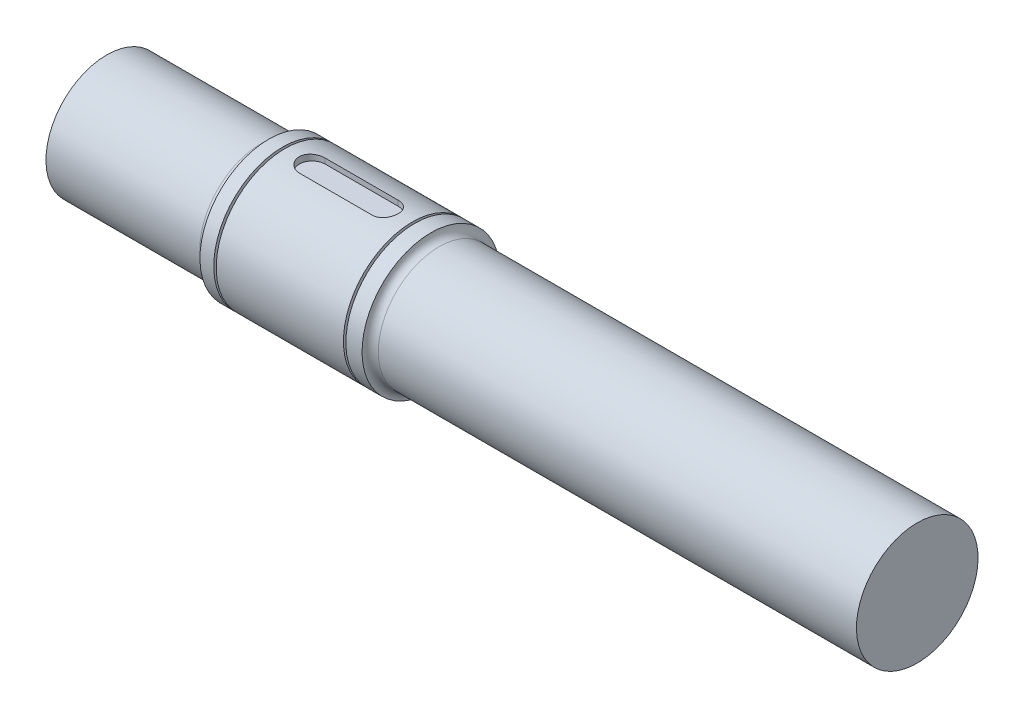
ISO-10303-21;
HEADER;
FILE_DESCRIPTION(('STEP AP214'),'2;1');
FILE_NAME('part.step','',(''),(''),'','','');
FILE_SCHEMA(('AUTOMOTIVE_DESIGN { 1 0 10303 214 1 1 1 1 }'));
ENDSEC;
DATA;
#1=APPLICATION_CONTEXT('core data for automotive mechanical design processes');
#2=APPLICATION_PROTOCOL_DEFINITION('international standard','automotive_design',2000,#1);
#3=PRODUCT_CONTEXT('',#1,'mechanical');
#4=PRODUCT('Part','Part','',(#3));
#5=PRODUCT_RELATED_PRODUCT_CATEGORY('part','',(#4));
#6=PRODUCT_DEFINITION_FORMATION('','',#4);
#7=PRODUCT_DEFINITION_CONTEXT('part definition',#1,'design');
#8=PRODUCT_DEFINITION('design','',#6,#7);
#9=PRODUCT_DEFINITION_SHAPE('','',#8);
#10=(LENGTH_UNIT() NAMED_UNIT(*) SI_UNIT(.MILLI.,.METRE.));
#11=(NAMED_UNIT(*) PLANE_ANGLE_UNIT() SI_UNIT($,.RADIAN.));
#12=(NAMED_UNIT(*) SI_UNIT($,.STERADIAN.) SOLID_ANGLE_UNIT());
#13=UNCERTAINTY_MEASURE_WITH_UNIT(LENGTH_MEASURE(1.E-05),#10,'distance_accuracy_value','');
#14=(GEOMETRIC_REPRESENTATION_CONTEXT(3) GLOBAL_UNCERTAINTY_ASSIGNED_CONTEXT((#13)) GLOBAL_UNIT_ASSIGNED_CONTEXT((#10,
#11,#12)) REPRESENTATION_CONTEXT('',''));
#15=CARTESIAN_POINT('',(0.,0.,0.));
#16=DIRECTION('',(0.,0.,1.));
#17=DIRECTION('',(1.,0.,0.));
#18=AXIS2_PLACEMENT_3D('',#15,#16,#17);
#19=CARTESIAN_POINT('',(500.,0.,0.));
#20=DIRECTION('',(1.,0.,0.));
#21=DIRECTION('',(0.,1.,0.));
#22=AXIS2_PLACEMENT_3D('',#19,#20,#21);
#23=CYLINDRICAL_SURFACE('',#22,42.4999999999999);
#24=CARTESIAN_POINT('',(171.75,41.7402683268807,7.99999999999999));
#25=CARTESIAN_POINT('',(171.972876252874,41.74024964676,8.00002638738209));
#26=CARTESIAN_POINT('',(172.195746005137,41.7420527975313,7.99068730777201));
#27=CARTESIAN_POINT('',(172.639851165881,41.7491672190507,7.95347087707992));
#28=CARTESIAN_POINT('',(172.861086759092,41.7544780869463,7.92559565482519));
#29=CARTESIAN_POINT('',(173.30004074749,41.7684624733616,7.85155238927755));
#30=CARTESIAN_POINT('',(173.517763711367,41.7771311823803,7.80541050760325));
#31=CARTESIAN_POINT('',(173.948473817033,41.7975721683013,7.69520108898551));
#32=CARTESIAN_POINT('',(174.161460948551,41.8093444519336,7.63113351317109));
#33=CARTESIAN_POINT('',(174.581200811115,41.8356524237168,7.48556247747303));
#34=CARTESIAN_POINT('',(174.787953852888,41.8501879738729,7.40405988825206));
#35=CARTESIAN_POINT('',(175.193892499025,41.8816120314206,7.22418907999825));
#36=CARTESIAN_POINT('',(175.393075271321,41.8985014085729,7.12581462354242));
#37=CARTESIAN_POINT('',(175.782386174651,41.9341456235329,6.91296351401488));
#38=CARTESIAN_POINT('',(175.972517055355,41.9528998894321,6.79849179308436));
#39=CARTESIAN_POINT('',(176.342585958317,41.9917606979855,6.55418430068742));
#40=CARTESIAN_POINT('',(176.522520353114,42.0118677163942,6.4243431115545));
#41=CARTESIAN_POINT('',(176.872841811386,42.0530963806769,6.14871592403473));
#42=CARTESIAN_POINT('',(177.043102728111,42.0742267270698,6.00277087021121));
#43=CARTESIAN_POINT('',(177.370763789705,42.1167020145395,5.69712304517567));
#44=CARTESIAN_POINT('',(177.5281638576,42.1380469568998,5.53742019163341));
#45=CARTESIAN_POINT('',(177.829078861389,42.1803626870852,5.20528873620787));
#46=CARTESIAN_POINT('',(177.97258937658,42.2013333540669,5.03285611333132));
#47=CARTESIAN_POINT('',(178.244632048779,42.2423030005201,4.67653517673608));
#48=CARTESIAN_POINT('',(178.373169059542,42.262302293636,4.4926506050653));
#49=CARTESIAN_POINT('',(178.615361956177,42.3009312537243,4.11313431692967));
#50=CARTESIAN_POINT('',(178.728892892034,42.3195489155617,3.91742160547746));
#51=CARTESIAN_POINT('',(178.939038399689,42.354710910477,3.5169393565046));
#52=CARTESIAN_POINT('',(179.035653227178,42.3712552748922,3.31216995593636));
#53=CARTESIAN_POINT('',(179.211230816347,42.4017981622791,2.89503642115217));
#54=CARTESIAN_POINT('',(179.290195315437,42.4157969358009,2.68267303683919));
#55=CARTESIAN_POINT('',(179.429869451825,42.4408490709869,2.25186123505652));
#56=CARTESIAN_POINT('',(179.490579693826,42.4519025302184,2.0334130194193));
#57=CARTESIAN_POINT('',(179.592675088631,42.4706376420979,1.59455847510228));
#58=CARTESIAN_POINT('',(179.634274511748,42.4783566192597,1.37420357814867));
#59=CARTESIAN_POINT('',(179.698826954575,42.4903852923674,0.930768865245296));
#60=CARTESIAN_POINT('',(179.721786878932,42.4946962507335,0.707690089415522));
#61=CARTESIAN_POINT('',(179.748903469914,42.4997915130049,0.260323227762221));
#62=CARTESIAN_POINT('',(179.75305769229,42.5005753584778,0.0360349885328318));
#63=CARTESIAN_POINT('',(179.742522595968,42.4985928066171,-0.412081849873664));
#64=CARTESIAN_POINT('',(179.727833406772,42.4958264336824,-0.63591045219905));
#65=CARTESIAN_POINT('',(179.680039249628,42.486880114612,-1.07861448576768));
#66=CARTESIAN_POINT('',(179.647172908302,42.4807444077911,-1.29751662477981));
#67=CARTESIAN_POINT('',(179.563434003711,42.4652570845993,-1.73181175985722));
#68=CARTESIAN_POINT('',(179.512555203853,42.4559043544057,-1.94720351344138));
#69=CARTESIAN_POINT('',(179.39319283344,42.4342427335021,-2.37285752928994));
#70=CARTESIAN_POINT('',(179.324712326815,42.4219343573063,-2.58312067732414));
#71=CARTESIAN_POINT('',(179.170651903723,42.3946969623122,-2.99711691561317));
#72=CARTESIAN_POINT('',(179.085071393701,42.3797678525485,-3.20084977891233));
#73=CARTESIAN_POINT('',(178.896903038054,42.347604248901,-3.60153348940606));
#74=CARTESIAN_POINT('',(178.794221431535,42.3303571527053,-3.79843928706659));
#75=CARTESIAN_POINT('',(178.572932781513,42.2940953770984,-4.18291611358777));
#76=CARTESIAN_POINT('',(178.454325692889,42.2750806926792,-4.37048711599812));
#77=CARTESIAN_POINT('',(178.202006860056,42.2358007743927,-4.73505590771169));
#78=CARTESIAN_POINT('',(178.068294174732,42.2155354626441,-4.91205303718513));
#79=CARTESIAN_POINT('',(177.786685648557,42.1743070922359,-5.25428718760116));
#80=CARTESIAN_POINT('',(177.63878995461,42.1533440408049,-5.41952433031937));
#81=CARTESIAN_POINT('',(177.327402355901,42.1109637096833,-5.73961746948151));
#82=CARTESIAN_POINT('',(177.163703812863,42.0895444334843,-5.89427225542901));
#83=CARTESIAN_POINT('',(176.823877885526,42.0471857732164,-6.18921358785718));
#84=CARTESIAN_POINT('',(176.647754691221,42.0262462304919,-6.32950493939817));
#85=CARTESIAN_POINT('',(176.284143982945,41.9854238671915,-6.5948630300937));
#86=CARTESIAN_POINT('',(176.096651137104,41.9655415507408,-6.71992254217281));
#87=CARTESIAN_POINT('',(175.711666909785,41.9274149400696,-6.95384252937324));
#88=CARTESIAN_POINT('',(175.514175849843,41.9091705932255,-7.06270352498396));
#89=CARTESIAN_POINT('',(175.110084807012,41.8748081241901,-7.26366762641157));
#90=CARTESIAN_POINT('',(174.903464636577,41.8586950648487,-7.3557310196158));
#91=CARTESIAN_POINT('',(174.483010242894,41.8291211721582,-7.52208513375798));
#92=CARTESIAN_POINT('',(174.269176263851,41.8156602491325,-7.59637645564011));
#93=CARTESIAN_POINT('',(173.836094374806,41.7918066278175,-7.7265306579988));
#94=CARTESIAN_POINT('',(173.616853436231,41.7814101817084,-7.78241605860737));
#95=CARTESIAN_POINT('',(173.174385269956,41.763980189076,-7.87541737390567));
#96=CARTESIAN_POINT('',(172.951159996985,41.7569450381099,-7.91254224402467));
#97=CARTESIAN_POINT('',(172.564656788557,41.7479029607448,-7.96008886281845));
#98=CARTESIAN_POINT('',(172.401943827869,41.7450422662949,-7.9750628919611));
#99=CARTESIAN_POINT('',(172.076158965402,41.741224181121,-7.99501271637431));
#100=CARTESIAN_POINT('',(171.913088128206,41.7402635960688,-8.00000529190225));
#101=CARTESIAN_POINT('',(171.75,41.7402683268807,-8.00000000000001));
#102=B_SPLINE_CURVE_WITH_KNOTS('',3,(#24,#25,#26,#27,#28,#29,#30,#31,#32,#33,#34,#35,#36,#37,
#38,#39,#40,#41,#42,#43,#44,#45,#46,#47,#48,#49,#50,#51,#52,#53,#54,#55,#56,#57,#58,#59,#60,#61,
#62,#63,#64,#65,#66,#67,#68,#69,#70,#71,#72,#73,#74,#75,#76,#77,#78,#79,#80,#81,#82,#83,#84,#85,
#86,#87,#88,#89,#90,#91,#92,#93,#94,#95,#96,#97,#98,#99,#100,#101),.UNSPECIFIED.,.F.,.F.,(4,2,2,
2,2,2,2,2,2,2,2,2,2,2,2,2,2,2,2,2,2,2,2,2,2,2,2,2,2,2,2,2,2,2,2,2,2,2,4),(0.,0.668416151657752,
1.33675555073162,2.00414119311053,2.67152828269358,3.33888205234599,4.00648307240148,
4.67387998590976,5.34151285825678,6.01645774042933,6.6914066619278,7.3665697015252,
8.04151327022566,8.72176362881024,9.4020037043777,10.0821767910007,10.76232734324,
11.4346538606808,12.1067312137936,12.7788959168777,13.4510560005146,14.1145946234458,
14.7783632134798,15.442016339361,16.1056925051084,16.7731350512268,17.4405794884471,
18.1080655320571,18.7755446627886,19.4533957352959,20.1310192973411,20.8089631302903,
21.4868851748976,22.1663897515018,22.8458713481137,23.5245184655006,24.2028413206851,
24.6928169913412,25.1819682475189),.UNSPECIFIED.);
#103=CARTESIAN_POINT('',(171.75,41.7402683268807,7.99999999999999));
#104=VERTEX_POINT('',#103);
#105=CARTESIAN_POINT('',(171.75,41.7402683268807,-8.00000000000001));
#106=VERTEX_POINT('',#105);
#107=EDGE_CURVE('E148',#104,#106,#102,.T.);
#108=ORIENTED_EDGE('',*,*,#107,.F.);
#109=DIRECTION('',(1.,0.,0.));
#110=VECTOR('',#109,1.);
#111=CARTESIAN_POINT('',(500.,41.7402683268807,7.99999999999993));
#112=LINE('',#111,#110);
#113=CARTESIAN_POINT('',(126.75,41.7402683268806,8.));
#114=VERTEX_POINT('',#113);
#115=EDGE_CURVE('E11',#114,#104,#112,.T.);
#116=ORIENTED_EDGE('',*,*,#115,.F.);
#117=CARTESIAN_POINT('',(126.75,41.7402683268806,-8.));
#118=CARTESIAN_POINT('',(126.527123747126,41.74024964676,-8.0000263873821));
#119=CARTESIAN_POINT('',(126.304253994863,41.7420527975312,-7.99068730777202));
#120=CARTESIAN_POINT('',(125.860148834119,41.7491672190507,-7.95347087707993));
#121=CARTESIAN_POINT('',(125.638913240908,41.7544780869463,-7.9255956548252));
#122=CARTESIAN_POINT('',(125.19995925251,41.7684624733616,-7.85155238927756));
#123=CARTESIAN_POINT('',(124.982236288633,41.7771311823803,-7.80541050760326));
#124=CARTESIAN_POINT('',(124.551526182967,41.7975721683013,-7.69520108898552));
#125=CARTESIAN_POINT('',(124.338539051449,41.8093444519336,-7.6311335131711));
#126=CARTESIAN_POINT('',(123.918799188885,41.8356524237168,-7.48556247747304));
#127=CARTESIAN_POINT('',(123.712046147112,41.8501879738729,-7.40405988825206));
#128=CARTESIAN_POINT('',(123.306107500974,41.8816120314206,-7.22418907999825));
#129=CARTESIAN_POINT('',(123.106924728679,41.8985014085729,-7.12581462354243));
#130=CARTESIAN_POINT('',(122.717613825349,41.9341456235329,-6.9129635140149));
#131=CARTESIAN_POINT('',(122.527482944645,41.9528998894321,-6.79849179308438));
#132=CARTESIAN_POINT('',(122.157414041683,41.9917606979855,-6.55418430068744));
#133=CARTESIAN_POINT('',(121.977479646886,42.0118677163942,-6.42434311155452));
#134=CARTESIAN_POINT('',(121.627158188614,42.0530963806769,-6.14871592403475));
#135=CARTESIAN_POINT('',(121.456897271889,42.0742267270698,-6.00277087021123));
#136=CARTESIAN_POINT('',(121.129236210295,42.1167020145395,-5.6971230451757));
#137=CARTESIAN_POINT('',(120.9718361424,42.1380469568998,-5.53742019163345));
#138=CARTESIAN_POINT('',(120.670921138611,42.1803626870852,-5.20528873620791));
#139=CARTESIAN_POINT('',(120.52741062342,42.2013333540669,-5.03285611333136));
#140=CARTESIAN_POINT('',(120.255367951221,42.2423030005201,-4.67653517673612));
#141=CARTESIAN_POINT('',(120.126830940458,42.262302293636,-4.49265060506533));
#142=CARTESIAN_POINT('',(119.884638043823,42.3009312537243,-4.1131343169297));
#143=CARTESIAN_POINT('',(119.771107107966,42.3195489155617,-3.91742160547749));
#144=CARTESIAN_POINT('',(119.560961600311,42.354710910477,-3.51693935650463));
#145=CARTESIAN_POINT('',(119.464346772822,42.3712552748922,-3.31216995593639));
#146=CARTESIAN_POINT('',(119.288769183653,42.4017981622791,-2.89503642115221));
#147=CARTESIAN_POINT('',(119.209804684563,42.4157969358009,-2.68267303683923));
#148=CARTESIAN_POINT('',(119.070130548175,42.4408490709869,-2.25186123505655));
#149=CARTESIAN_POINT('',(119.009420306174,42.4519025302184,-2.03341301941932));
#150=CARTESIAN_POINT('',(118.907324911369,42.4706376420979,-1.5945584751023));
#151=CARTESIAN_POINT('',(118.865725488252,42.4783566192597,-1.3742035781487));
#152=CARTESIAN_POINT('',(118.801173045425,42.4903852923674,-0.930768865245321));
#153=CARTESIAN_POINT('',(118.778213121068,42.4946962507334,-0.707690089415547));
#154=CARTESIAN_POINT('',(118.751096530086,42.4997915130049,-0.260323227762247));
#155=CARTESIAN_POINT('',(118.74694230771,42.5005753584778,-0.0360349885328585));
#156=CARTESIAN_POINT('',(118.757477404032,42.498592806617,0.412081849873636));
#157=CARTESIAN_POINT('',(118.772166593228,42.4958264336824,0.635910452199022));
#158=CARTESIAN_POINT('',(118.819960750372,42.486880114612,1.07861448576765));
#159=CARTESIAN_POINT('',(118.852827091697,42.480744407791,1.29751662477978));
#160=CARTESIAN_POINT('',(118.936565996289,42.4652570845992,1.73181175985719));
#161=CARTESIAN_POINT('',(118.987444796147,42.4559043544057,1.94720351344135));
#162=CARTESIAN_POINT('',(119.10680716656,42.4342427335021,2.37285752928991));
#163=CARTESIAN_POINT('',(119.175287673185,42.4219343573063,2.58312067732411));
#164=CARTESIAN_POINT('',(119.329348096277,42.3946969623122,2.99711691561314));
#165=CARTESIAN_POINT('',(119.414928606299,42.3797678525485,3.20084977891231));
#166=CARTESIAN_POINT('',(119.603096961946,42.347604248901,3.60153348940604));
#167=CARTESIAN_POINT('',(119.705778568465,42.3303571527053,3.79843928706657));
#168=CARTESIAN_POINT('',(119.927067218487,42.2940953770984,4.18291611358775));
#169=CARTESIAN_POINT('',(120.045674307111,42.2750806926791,4.37048711599811));
#170=CARTESIAN_POINT('',(120.297993139944,42.2358007743927,4.73505590771168));
#171=CARTESIAN_POINT('',(120.431705825268,42.2155354626441,4.91205303718514));
#172=CARTESIAN_POINT('',(120.713314351443,42.1743070922359,5.25428718760117));
#173=CARTESIAN_POINT('',(120.86121004539,42.1533440408049,5.41952433031937));
#174=CARTESIAN_POINT('',(121.172597644099,42.1109637096833,5.7396174694815));
#175=CARTESIAN_POINT('',(121.336296187137,42.0895444334843,5.894272255429));
#176=CARTESIAN_POINT('',(121.676122114474,42.0471857732164,6.18921358785716));
#177=CARTESIAN_POINT('',(121.852245308779,42.0262462304919,6.32950493939815));
#178=CARTESIAN_POINT('',(122.215856017055,41.9854238671915,6.59486303009369));
#179=CARTESIAN_POINT('',(122.403348862896,41.9655415507408,6.71992254217281));
#180=CARTESIAN_POINT('',(122.788333090215,41.9274149400696,6.95384252937324));
#181=CARTESIAN_POINT('',(122.985824150157,41.9091705932255,7.06270352498396));
#182=CARTESIAN_POINT('',(123.389915192988,41.8748081241901,7.26366762641157));
#183=CARTESIAN_POINT('',(123.596535363423,41.8586950648487,7.3557310196158));
#184=CARTESIAN_POINT('',(124.016989757106,41.8291211721582,7.52208513375797));
#185=CARTESIAN_POINT('',(124.230823736149,41.8156602491325,7.59637645564011));
#186=CARTESIAN_POINT('',(124.663905625194,41.7918066278175,7.7265306579988));
#187=CARTESIAN_POINT('',(124.883146563769,41.7814101817084,7.78241605860736));
#188=CARTESIAN_POINT('',(125.325614730044,41.763980189076,7.87541737390566));
#189=CARTESIAN_POINT('',(125.548840003015,41.7569450381099,7.91254224402466));
#190=CARTESIAN_POINT('',(125.935343211443,41.7479029607448,7.96008886281844));
#191=CARTESIAN_POINT('',(126.098056172131,41.7450422662949,7.97506289196109));
#192=CARTESIAN_POINT('',(126.423841034598,41.7412241811209,7.9950127163743));
#193=CARTESIAN_POINT('',(126.586911871794,41.7402635960688,8.00000529190224));
#194=CARTESIAN_POINT('',(126.75,41.7402683268806,8.));
#195=B_SPLINE_CURVE_WITH_KNOTS('',3,(#117,#118,#119,#120,#121,#122,#123,#124,#125,#126,#127,
#128,#129,#130,#131,#132,#133,#134,#135,#136,#137,#138,#139,#140,#141,#142,#143,#144,#145,#146,
#147,#148,#149,#150,#151,#152,#153,#154,#155,#156,#157,#158,#159,#160,#161,#162,#163,#164,#165,
#166,#167,#168,#169,#170,#171,#172,#173,#174,#175,#176,#177,#178,#179,#180,#181,#182,#183,#184,
#185,#186,#187,#188,#189,#190,#191,#192,#193,#194),.UNSPECIFIED.,.F.,.F.,(4,2,2,2,2,2,2,2,2,2,2,
2,2,2,2,2,2,2,2,2,2,2,2,2,2,2,2,2,2,2,2,2,2,2,2,2,2,2,4),(0.,0.668416151657752,1.33675555073162,
2.00414119311055,2.67152828269356,3.338882052346,4.00648307240148,4.67387998590973,
5.34151285825677,6.01645774042931,6.69140666192776,7.36656970152516,8.04151327022564,
8.72176362881022,9.40200370437767,10.0821767910006,10.76232734324,11.4346538606808,
12.1067312137936,12.7788959168777,13.4510560005146,14.1145946234458,14.7783632134798,
15.442016339361,16.1056925051084,16.7731350512268,17.4405794884471,18.1080655320572,
18.7755446627886,19.4533957352959,20.1310192973411,20.8089631302903,21.4868851748976,
22.1663897515019,22.8458713481137,23.5245184655006,24.2028413206851,24.6928169913413,
25.1819682475189),.UNSPECIFIED.);
#196=CARTESIAN_POINT('',(126.75,41.7402683268806,-8.));
#197=VERTEX_POINT('',#196);
#198=EDGE_CURVE('E45',#197,#114,#195,.T.);
#199=ORIENTED_EDGE('',*,*,#198,.F.);
#200=DIRECTION('',(1.,0.,0.));
#201=VECTOR('',#200,1.);
#202=CARTESIAN_POINT('',(500.,41.7402683268807,-8.00000000000007));
#203=LINE('',#202,#201);
#204=EDGE_CURVE('E156',#106,#197,#203,.F.);
#205=ORIENTED_EDGE('',*,*,#204,.F.);
#206=EDGE_LOOP('',(#108,#116,#199,#205));
#207=FACE_BOUND('',#206,.T.);
#208=CARTESIAN_POINT('',(110.,0.,0.));
#209=DIRECTION('',(1.,0.,0.));
#210=DIRECTION('',(0.,0.,-1.));
#211=AXIS2_PLACEMENT_3D('',#208,#209,#210);
#212=CIRCLE('',#211,42.4999999999999);
#213=CARTESIAN_POINT('',(110.,0.,-42.4999999999999));
#214=VERTEX_POINT('',#213);
#215=EDGE_CURVE('E122',#214,#214,#212,.T.);
#216=ORIENTED_EDGE('',*,*,#215,.T.);
#217=EDGE_LOOP('',(#216));
#218=FACE_BOUND('',#217,.T.);
#219=CARTESIAN_POINT('',(188.5,0.,0.));
#220=DIRECTION('',(1.,0.,0.));
#221=DIRECTION('',(0.,0.,-1.));
#222=AXIS2_PLACEMENT_3D('',#219,#220,#221);
#223=CIRCLE('',#222,42.4999999999999);
#224=CARTESIAN_POINT('',(188.5,0.,-42.4999999999999));
#225=VERTEX_POINT('',#224);
#226=EDGE_CURVE('E113',#225,#225,#223,.T.);
#227=ORIENTED_EDGE('',*,*,#226,.F.);
#228=EDGE_LOOP('',(#227));
#229=FACE_BOUND('',#228,.T.);
#230=ADVANCED_FACE('F37',(#207,#218,#229),#23,.T.);
#231=CARTESIAN_POINT('',(100.,0.,0.));
#232=DIRECTION('',(1.,0.,0.));
#233=DIRECTION('',(0.,1.,0.));
#234=AXIS2_PLACEMENT_3D('',#231,#232,#233);
#235=CIRCLE('',#234,42.5);
#236=CARTESIAN_POINT('',(100.,42.5,0.));
#237=VERTEX_POINT('',#236);
#238=EDGE_CURVE('E139',#237,#237,#235,.T.);
#239=ORIENTED_EDGE('',*,*,#238,.T.);
#240=EDGE_LOOP('',(#239));
#241=FACE_BOUND('',#240,.T.);
#242=CARTESIAN_POINT('',(108.5,0.,0.));
#243=DIRECTION('',(1.,0.,0.));
#244=DIRECTION('',(0.,0.,-1.));
#245=AXIS2_PLACEMENT_3D('',#242,#243,#244);
#246=CIRCLE('',#245,42.4999999999999);
#247=CARTESIAN_POINT('',(108.5,0.,-42.4999999999999));
#248=VERTEX_POINT('',#247);
#249=EDGE_CURVE('E125',#248,#248,#246,.T.);
#250=ORIENTED_EDGE('',*,*,#249,.F.);
#251=EDGE_LOOP('',(#250));
#252=FACE_BOUND('',#251,.T.);
#253=ADVANCED_FACE('F183',(#241,#252),#23,.T.);
#254=CARTESIAN_POINT('',(0.,0.,0.));
#255=DIRECTION('',(-1.,0.,0.));
#256=DIRECTION('',(0.,-1.,0.));
#257=AXIS2_PLACEMENT_3D('',#254,#255,#256);
#258=PLANE('',#257);
#259=CARTESIAN_POINT('',(0.,0.,0.));
#260=DIRECTION('',(1.,0.,0.));
#261=DIRECTION('',(0.,1.,0.));
#262=AXIS2_PLACEMENT_3D('',#259,#260,#261);
#263=CIRCLE('',#262,37.5);
#264=CARTESIAN_POINT('',(0.,37.5,0.));
#265=VERTEX_POINT('',#264);
#266=EDGE_CURVE('E145',#265,#265,#263,.T.);
#267=ORIENTED_EDGE('',*,*,#266,.F.);
#268=EDGE_LOOP('',(#267));
#269=FACE_BOUND('',#268,.T.);
#270=ADVANCED_FACE('F39',(#269),#258,.T.);
#271=CARTESIAN_POINT('',(500.,0.,0.));
#272=DIRECTION('',(1.,0.,0.));
#273=DIRECTION('',(0.,1.,0.));
#274=AXIS2_PLACEMENT_3D('',#271,#272,#273);
#275=CYLINDRICAL_SURFACE('',#274,37.5);
#276=ORIENTED_EDGE('',*,*,#266,.T.);
#277=EDGE_LOOP('',(#276));
#278=FACE_BOUND('',#277,.T.);
#279=CARTESIAN_POINT('',(95.,0.,0.));
#280=DIRECTION('',(1.,0.,0.));
#281=DIRECTION('',(0.,1.,0.));
#282=AXIS2_PLACEMENT_3D('',#279,#280,#281);
#283=CIRCLE('',#282,37.5);
#284=CARTESIAN_POINT('',(95.,37.5,0.));
#285=VERTEX_POINT('',#284);
#286=EDGE_CURVE('E142',#285,#285,#283,.T.);
#287=ORIENTED_EDGE('',*,*,#286,.F.);
#288=EDGE_LOOP('',(#287));
#289=FACE_BOUND('',#288,.T.);
#290=ADVANCED_FACE('F239',(#278,#289),#275,.T.);
#291=CARTESIAN_POINT('',(95.,0.,0.));
#292=DIRECTION('',(1.,0.,0.));
#293=DIRECTION('',(0.,1.,0.));
#294=AXIS2_PLACEMENT_3D('',#291,#292,#293);
#295=TOROIDAL_SURFACE('',#294,42.5,5.);
#296=ORIENTED_EDGE('',*,*,#286,.T.);
#297=EDGE_LOOP('',(#296));
#298=FACE_BOUND('',#297,.T.);
#299=ORIENTED_EDGE('',*,*,#238,.F.);
#300=EDGE_LOOP('',(#299));
#301=FACE_BOUND('',#300,.T.);
#302=ADVANCED_FACE('F207',(#298,#301),#295,.F.);
#303=CARTESIAN_POINT('',(108.5,0.,0.));
#304=DIRECTION('',(1.,0.,0.));
#305=DIRECTION('',(0.,0.,-1.));
#306=AXIS2_PLACEMENT_3D('',#303,#304,#305);
#307=PLANE('',#306);
#308=CARTESIAN_POINT('',(108.5,0.,0.));
#309=DIRECTION('',(1.,0.,0.));
#310=DIRECTION('',(0.,0.,-1.));
#311=AXIS2_PLACEMENT_3D('',#308,#309,#310);
#312=CIRCLE('',#311,39.4999999999999);
#313=CARTESIAN_POINT('',(108.5,0.,-39.4999999999999));
#314=VERTEX_POINT('',#313);
#315=EDGE_CURVE('E119',#314,#314,#312,.T.);
#316=ORIENTED_EDGE('',*,*,#315,.F.);
#317=EDGE_LOOP('',(#316));
#318=FACE_BOUND('',#317,.T.);
#319=ORIENTED_EDGE('',*,*,#249,.T.);
#320=EDGE_LOOP('',(#319));
#321=FACE_BOUND('',#320,.T.);
#322=ADVANCED_FACE('F204',(#318,#321),#307,.T.);
#323=CARTESIAN_POINT('',(110.,0.,0.));
#324=DIRECTION('',(1.,0.,0.));
#325=DIRECTION('',(0.,0.,-1.));
#326=AXIS2_PLACEMENT_3D('',#323,#324,#325);
#327=PLANE('',#326);
#328=CARTESIAN_POINT('',(110.,0.,0.));
#329=DIRECTION('',(1.,0.,0.));
#330=DIRECTION('',(0.,0.,-1.));
#331=AXIS2_PLACEMENT_3D('',#328,#329,#330);
#332=CIRCLE('',#331,39.4999999999999);
#333=CARTESIAN_POINT('',(110.,0.,-39.4999999999999));
#334=VERTEX_POINT('',#333);
#335=EDGE_CURVE('E116',#334,#334,#332,.T.);
#336=ORIENTED_EDGE('',*,*,#335,.T.);
#337=EDGE_LOOP('',(#336));
#338=FACE_BOUND('',#337,.T.);
#339=ORIENTED_EDGE('',*,*,#215,.F.);
#340=EDGE_LOOP('',(#339));
#341=FACE_BOUND('',#340,.T.);
#342=ADVANCED_FACE('F199',(#338,#341),#327,.F.);
#343=CARTESIAN_POINT('',(108.5,0.,0.));
#344=DIRECTION('',(1.,0.,0.));
#345=DIRECTION('',(0.,0.,-1.));
#346=AXIS2_PLACEMENT_3D('',#343,#344,#345);
#347=CYLINDRICAL_SURFACE('',#346,39.4999999999999);
#348=ORIENTED_EDGE('',*,*,#315,.T.);
#349=EDGE_LOOP('',(#348));
#350=FACE_BOUND('',#349,.T.);
#351=ORIENTED_EDGE('',*,*,#335,.F.);
#352=EDGE_LOOP('',(#351));
#353=FACE_BOUND('',#352,.T.);
#354=ADVANCED_FACE('F191',(#350,#353),#347,.T.);
#355=CARTESIAN_POINT('',(188.5,0.,0.));
#356=DIRECTION('',(1.,0.,0.));
#357=DIRECTION('',(0.,0.,-1.));
#358=AXIS2_PLACEMENT_3D('',#355,#356,#357);
#359=PLANE('',#358);
#360=CARTESIAN_POINT('',(188.5,0.,0.));
#361=DIRECTION('',(1.,0.,0.));
#362=DIRECTION('',(0.,0.,-1.));
#363=AXIS2_PLACEMENT_3D('',#360,#361,#362);
#364=CIRCLE('',#363,39.4999999999999);
#365=CARTESIAN_POINT('',(188.5,0.,-39.4999999999999));
#366=VERTEX_POINT('',#365);
#367=EDGE_CURVE('E107',#366,#366,#364,.T.);
#368=ORIENTED_EDGE('',*,*,#367,.F.);
#369=EDGE_LOOP('',(#368));
#370=FACE_BOUND('',#369,.T.);
#371=ORIENTED_EDGE('',*,*,#226,.T.);
#372=EDGE_LOOP('',(#371));
#373=FACE_BOUND('',#372,.T.);
#374=ADVANCED_FACE('F188',(#370,#373),#359,.T.);
#375=CARTESIAN_POINT('',(190.,0.,0.));
#376=DIRECTION('',(1.,0.,0.));
#377=DIRECTION('',(0.,0.,-1.));
#378=AXIS2_PLACEMENT_3D('',#375,#376,#377);
#379=PLANE('',#378);
#380=CARTESIAN_POINT('',(190.,0.,0.));
#381=DIRECTION('',(1.,0.,0.));
#382=DIRECTION('',(0.,0.,-1.));
#383=AXIS2_PLACEMENT_3D('',#380,#381,#382);
#384=CIRCLE('',#383,39.4999999999999);
#385=CARTESIAN_POINT('',(190.,0.,-39.4999999999999));
#386=VERTEX_POINT('',#385);
#387=EDGE_CURVE('E102',#386,#386,#384,.T.);
#388=ORIENTED_EDGE('',*,*,#387,.T.);
#389=EDGE_LOOP('',(#388));
#390=FACE_BOUND('',#389,.T.);
#391=CARTESIAN_POINT('',(190.,0.,0.));
#392=DIRECTION('',(1.,0.,0.));
#393=DIRECTION('',(0.,0.,-1.));
#394=AXIS2_PLACEMENT_3D('',#391,#392,#393);
#395=CIRCLE('',#394,42.4999999999999);
#396=CARTESIAN_POINT('',(190.,0.,-42.4999999999999));
#397=VERTEX_POINT('',#396);
#398=EDGE_CURVE('E110',#397,#397,#395,.T.);
#399=ORIENTED_EDGE('',*,*,#398,.F.);
#400=EDGE_LOOP('',(#399));
#401=FACE_BOUND('',#400,.T.);
#402=ADVANCED_FACE('F190',(#390,#401),#379,.F.);
#403=CARTESIAN_POINT('',(188.5,0.,0.));
#404=DIRECTION('',(1.,0.,0.));
#405=DIRECTION('',(0.,0.,-1.));
#406=AXIS2_PLACEMENT_3D('',#403,#404,#405);
#407=CYLINDRICAL_SURFACE('',#406,39.4999999999999);
#408=ORIENTED_EDGE('',*,*,#367,.T.);
#409=EDGE_LOOP('',(#408));
#410=FACE_BOUND('',#409,.T.);
#411=ORIENTED_EDGE('',*,*,#387,.F.);
#412=EDGE_LOOP('',(#411));
#413=FACE_BOUND('',#412,.T.);
#414=ADVANCED_FACE('F174',(#410,#413),#407,.T.);
#415=CARTESIAN_POINT('',(500.,37.5,0.));
#416=DIRECTION('',(1.,0.,0.));
#417=DIRECTION('',(0.,1.,0.));
#418=AXIS2_PLACEMENT_3D('',#415,#416,#417);
#419=PLANE('',#418);
#420=CARTESIAN_POINT('',(500.,0.,0.));
#421=DIRECTION('',(1.,0.,0.));
#422=DIRECTION('',(0.,1.,0.));
#423=AXIS2_PLACEMENT_3D('',#420,#421,#422);
#424=CIRCLE('',#423,37.5);
#425=CARTESIAN_POINT('',(500.,37.5,0.));
#426=VERTEX_POINT('',#425);
#427=EDGE_CURVE('E128',#426,#426,#424,.T.);
#428=ORIENTED_EDGE('',*,*,#427,.T.);
#429=EDGE_LOOP('',(#428));
#430=FACE_BOUND('',#429,.T.);
#431=ADVANCED_FACE('F212',(#430),#419,.T.);
#432=CARTESIAN_POINT('',(500.,0.,0.));
#433=DIRECTION('',(1.,0.,0.));
#434=DIRECTION('',(0.,1.,0.));
#435=AXIS2_PLACEMENT_3D('',#432,#433,#434);
#436=CYLINDRICAL_SURFACE('',#435,37.5);
#437=CARTESIAN_POINT('',(205.,0.,0.));
#438=DIRECTION('',(1.,0.,0.));
#439=DIRECTION('',(0.,1.,0.));
#440=AXIS2_PLACEMENT_3D('',#437,#438,#439);
#441=CIRCLE('',#440,37.5);
#442=CARTESIAN_POINT('',(205.,37.5,0.));
#443=VERTEX_POINT('',#442);
#444=EDGE_CURVE('E133',#443,#443,#441,.T.);
#445=ORIENTED_EDGE('',*,*,#444,.T.);
#446=EDGE_LOOP('',(#445));
#447=FACE_BOUND('',#446,.T.);
#448=ORIENTED_EDGE('',*,*,#427,.F.);
#449=EDGE_LOOP('',(#448));
#450=FACE_BOUND('',#449,.T.);
#451=ADVANCED_FACE('F215',(#447,#450),#436,.T.);
#452=CARTESIAN_POINT('',(205.,0.,0.));
#453=DIRECTION('',(1.,0.,0.));
#454=DIRECTION('',(0.,1.,0.));
#455=AXIS2_PLACEMENT_3D('',#452,#453,#454);
#456=TOROIDAL_SURFACE('',#455,42.5,5.);
#457=CARTESIAN_POINT('',(200.,0.,0.));
#458=DIRECTION('',(1.,0.,0.));
#459=DIRECTION('',(0.,1.,0.));
#460=AXIS2_PLACEMENT_3D('',#457,#458,#459);
#461=CIRCLE('',#460,42.4999999999999);
#462=CARTESIAN_POINT('',(200.,42.5,0.));
#463=VERTEX_POINT('',#462);
#464=EDGE_CURVE('E136',#463,#463,#461,.T.);
#465=ORIENTED_EDGE('',*,*,#464,.T.);
#466=EDGE_LOOP('',(#465));
#467=FACE_BOUND('',#466,.T.);
#468=ORIENTED_EDGE('',*,*,#444,.F.);
#469=EDGE_LOOP('',(#468));
#470=FACE_BOUND('',#469,.T.);
#471=ADVANCED_FACE('F218',(#467,#470),#456,.F.);
#472=ORIENTED_EDGE('',*,*,#398,.T.);
#473=EDGE_LOOP('',(#472));
#474=FACE_BOUND('',#473,.T.);
#475=ORIENTED_EDGE('',*,*,#464,.F.);
#476=EDGE_LOOP('',(#475));
#477=FACE_BOUND('',#476,.T.);
#478=ADVANCED_FACE('F157',(#474,#477),#23,.T.);
#479=CARTESIAN_POINT('',(126.75,38.5,0.));
#480=DIRECTION('',(0.,1.,0.));
#481=DIRECTION('',(0.,0.,1.));
#482=AXIS2_PLACEMENT_3D('',#479,#480,#481);
#483=CYLINDRICAL_SURFACE('',#482,8.);
#484=DIRECTION('',(0.,1.,0.));
#485=VECTOR('',#484,1.);
#486=CARTESIAN_POINT('',(126.75,38.5,-8.));
#487=LINE('',#486,#485);
#488=CARTESIAN_POINT('',(126.75,38.5,-8.));
#489=VERTEX_POINT('',#488);
#490=EDGE_CURVE('E100',#489,#197,#487,.T.);
#491=ORIENTED_EDGE('',*,*,#490,.T.);
#492=ORIENTED_EDGE('',*,*,#198,.T.);
#493=DIRECTION('',(0.,1.,0.));
#494=VECTOR('',#493,1.);
#495=CARTESIAN_POINT('',(126.75,38.5,8.));
#496=LINE('',#495,#494);
#497=CARTESIAN_POINT('',(126.75,38.5,8.));
#498=VERTEX_POINT('',#497);
#499=EDGE_CURVE('E51',#498,#114,#496,.T.);
#500=ORIENTED_EDGE('',*,*,#499,.F.);
#501=CARTESIAN_POINT('',(126.75,38.5,0.));
#502=DIRECTION('',(0.,1.,0.));
#503=DIRECTION('',(0.,0.,1.));
#504=AXIS2_PLACEMENT_3D('',#501,#502,#503);
#505=CIRCLE('',#504,8.);
#506=EDGE_CURVE('E80',#489,#498,#505,.T.);
#507=ORIENTED_EDGE('',*,*,#506,.F.);
#508=EDGE_LOOP('',(#491,#492,#500,#507));
#509=FACE_BOUND('',#508,.T.);
#510=ADVANCED_FACE('F78',(#509),#483,.F.);
#511=CARTESIAN_POINT('',(126.75,38.5,-8.));
#512=DIRECTION('',(0.,0.,-1.));
#513=DIRECTION('',(-1.,0.,0.));
#514=AXIS2_PLACEMENT_3D('',#511,#512,#513);
#515=PLANE('',#514);
#516=ORIENTED_EDGE('',*,*,#204,.T.);
#517=ORIENTED_EDGE('',*,*,#490,.F.);
#518=DIRECTION('',(-1.,0.,0.));
#519=VECTOR('',#518,1.);
#520=CARTESIAN_POINT('',(126.75,38.5,-8.));
#521=LINE('',#520,#519);
#522=CARTESIAN_POINT('',(171.75,38.5,-8.00000000000001));
#523=VERTEX_POINT('',#522);
#524=EDGE_CURVE('E83',#523,#489,#521,.T.);
#525=ORIENTED_EDGE('',*,*,#524,.F.);
#526=DIRECTION('',(0.,1.,0.));
#527=VECTOR('',#526,1.);
#528=CARTESIAN_POINT('',(171.75,38.5,-8.00000000000001));
#529=LINE('',#528,#527);
#530=EDGE_CURVE('E103',#523,#106,#529,.T.);
#531=ORIENTED_EDGE('',*,*,#530,.T.);
#532=EDGE_LOOP('',(#516,#517,#525,#531));
#533=FACE_BOUND('',#532,.T.);
#534=ADVANCED_FACE('F166',(#533),#515,.F.);
#535=CARTESIAN_POINT('',(171.75,38.5,0.));
#536=DIRECTION('',(0.,1.,0.));
#537=DIRECTION('',(0.,0.,1.));
#538=AXIS2_PLACEMENT_3D('',#535,#536,#537);
#539=CYLINDRICAL_SURFACE('',#538,8.);
#540=DIRECTION('',(0.,1.,0.));
#541=VECTOR('',#540,1.);
#542=CARTESIAN_POINT('',(171.75,38.5,7.99999999999999));
#543=LINE('',#542,#541);
#544=CARTESIAN_POINT('',(171.75,38.5,7.99999999999999));
#545=VERTEX_POINT('',#544);
#546=EDGE_CURVE('E82',#545,#104,#543,.T.);
#547=ORIENTED_EDGE('',*,*,#546,.T.);
#548=ORIENTED_EDGE('',*,*,#107,.T.);
#549=ORIENTED_EDGE('',*,*,#530,.F.);
#550=CARTESIAN_POINT('',(171.75,38.5,0.));
#551=DIRECTION('',(0.,1.,0.));
#552=DIRECTION('',(0.,0.,1.));
#553=AXIS2_PLACEMENT_3D('',#550,#551,#552);
#554=CIRCLE('',#553,8.);
#555=EDGE_CURVE('E92',#545,#523,#554,.T.);
#556=ORIENTED_EDGE('',*,*,#555,.F.);
#557=EDGE_LOOP('',(#547,#548,#549,#556));
#558=FACE_BOUND('',#557,.T.);
#559=ADVANCED_FACE('F161',(#558),#539,.F.);
#560=CARTESIAN_POINT('',(126.75,38.5,8.));
#561=DIRECTION('',(0.,0.,1.));
#562=DIRECTION('',(1.,0.,0.));
#563=AXIS2_PLACEMENT_3D('',#560,#561,#562);
#564=PLANE('',#563);
#565=ORIENTED_EDGE('',*,*,#115,.T.);
#566=ORIENTED_EDGE('',*,*,#546,.F.);
#567=DIRECTION('',(1.,0.,0.));
#568=VECTOR('',#567,1.);
#569=CARTESIAN_POINT('',(126.75,38.5,8.));
#570=LINE('',#569,#568);
#571=EDGE_CURVE('E86',#498,#545,#570,.T.);
#572=ORIENTED_EDGE('',*,*,#571,.F.);
#573=ORIENTED_EDGE('',*,*,#499,.T.);
#574=EDGE_LOOP('',(#565,#566,#572,#573));
#575=FACE_BOUND('',#574,.T.);
#576=ADVANCED_FACE('F87',(#575),#564,.F.);
#577=CARTESIAN_POINT('',(126.75,38.5,0.));
#578=DIRECTION('',(0.,1.,0.));
#579=DIRECTION('',(0.,0.,1.));
#580=AXIS2_PLACEMENT_3D('',#577,#578,#579);
#581=PLANE('',#580);
#582=ORIENTED_EDGE('',*,*,#506,.T.);
#583=ORIENTED_EDGE('',*,*,#571,.T.);
#584=ORIENTED_EDGE('',*,*,#555,.T.);
#585=ORIENTED_EDGE('',*,*,#524,.T.);
#586=EDGE_LOOP('',(#582,#583,#584,#585));
#587=FACE_BOUND('',#586,.T.);
#588=ADVANCED_FACE('F94',(#587),#581,.T.);
#589=CLOSED_SHELL('',(#230,#253,#270,#290,#302,#322,#342,#354,#374,#402,#414,#431,#451,#471,
#478,#510,#534,#559,#576,#588));
#590=MANIFOLD_SOLID_BREP('B2',#589);
#591=ADVANCED_BREP_SHAPE_REPRESENTATION('',(#18,#590),#14);
#592=SHAPE_DEFINITION_REPRESENTATION(#9,#591);
ENDSEC;
END-ISO-10303-21;
